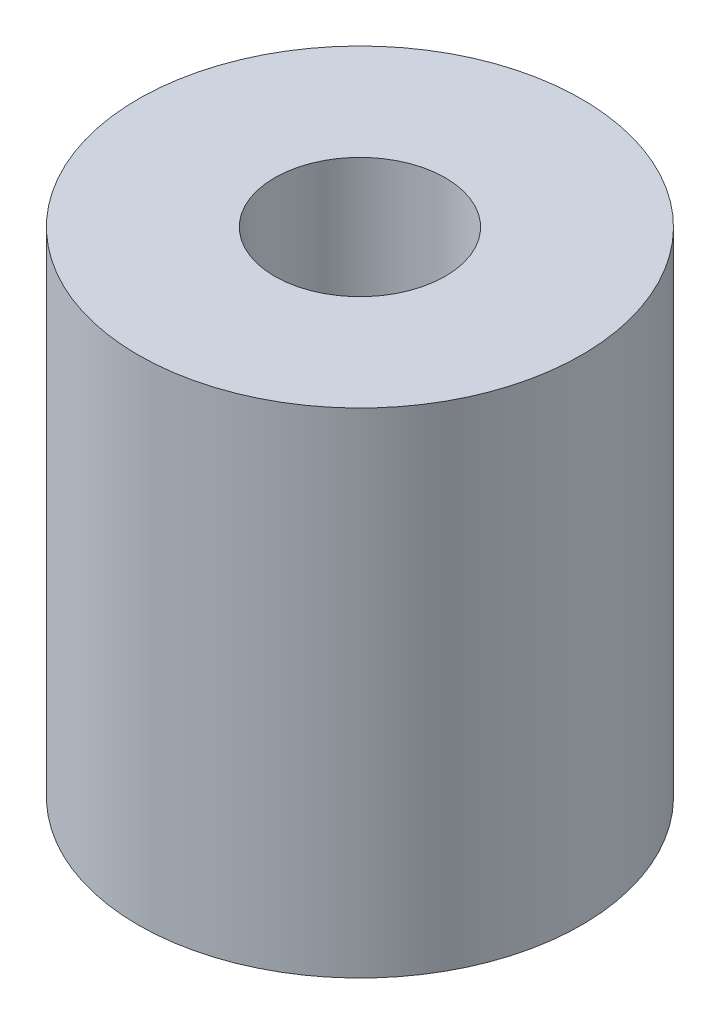
ISO-10303-21;
HEADER;
FILE_DESCRIPTION(('STEP AP214'),'2;1');
FILE_NAME('part.step','',(''),(''),'','','');
FILE_SCHEMA(('AUTOMOTIVE_DESIGN { 1 0 10303 214 1 1 1 1 }'));
ENDSEC;
DATA;
#1=APPLICATION_CONTEXT('core data for automotive mechanical design processes');
#2=APPLICATION_PROTOCOL_DEFINITION('international standard','automotive_design',2000,#1);
#3=PRODUCT_CONTEXT('',#1,'mechanical');
#4=PRODUCT('Part','Part','',(#3));
#5=PRODUCT_RELATED_PRODUCT_CATEGORY('part','',(#4));
#6=PRODUCT_DEFINITION_FORMATION('','',#4);
#7=PRODUCT_DEFINITION_CONTEXT('part definition',#1,'design');
#8=PRODUCT_DEFINITION('design','',#6,#7);
#9=PRODUCT_DEFINITION_SHAPE('','',#8);
#10=(LENGTH_UNIT() NAMED_UNIT(*) SI_UNIT(.MILLI.,.METRE.));
#11=(NAMED_UNIT(*) PLANE_ANGLE_UNIT() SI_UNIT($,.RADIAN.));
#12=(NAMED_UNIT(*) SI_UNIT($,.STERADIAN.) SOLID_ANGLE_UNIT());
#13=UNCERTAINTY_MEASURE_WITH_UNIT(LENGTH_MEASURE(1.E-05),#10,'distance_accuracy_value','');
#14=(GEOMETRIC_REPRESENTATION_CONTEXT(3) GLOBAL_UNCERTAINTY_ASSIGNED_CONTEXT((#13)) GLOBAL_UNIT_ASSIGNED_CONTEXT((#10,
#11,#12)) REPRESENTATION_CONTEXT('',''));
#15=CARTESIAN_POINT('',(0.,0.,0.));
#16=DIRECTION('',(0.,0.,1.));
#17=DIRECTION('',(1.,0.,0.));
#18=AXIS2_PLACEMENT_3D('',#15,#16,#17);
#19=CARTESIAN_POINT('',(0.,11.132,0.));
#20=DIRECTION('',(0.,-1.,0.));
#21=DIRECTION('',(0.,0.,-1.));
#22=AXIS2_PLACEMENT_3D('',#19,#20,#21);
#23=CYLINDRICAL_SURFACE('',#22,1.575);
#24=CARTESIAN_POINT('',(0.,0.,0.));
#25=DIRECTION('',(0.,1.,0.));
#26=DIRECTION('',(0.,0.,1.));
#27=AXIS2_PLACEMENT_3D('',#24,#25,#26);
#28=CIRCLE('',#27,1.575);
#29=CARTESIAN_POINT('',(0.,0.,1.575));
#30=VERTEX_POINT('',#29);
#31=EDGE_CURVE('E50',#30,#30,#28,.T.);
#32=ORIENTED_EDGE('',*,*,#31,.F.);
#33=EDGE_LOOP('',(#32));
#34=FACE_BOUND('',#33,.T.);
#35=CARTESIAN_POINT('',(0.,7.132,0.));
#36=DIRECTION('',(0.,1.,0.));
#37=DIRECTION('',(0.,0.,1.));
#38=AXIS2_PLACEMENT_3D('',#35,#36,#37);
#39=CIRCLE('',#38,1.575);
#40=CARTESIAN_POINT('',(0.,7.132,1.575));
#41=VERTEX_POINT('',#40);
#42=EDGE_CURVE('E58',#41,#41,#39,.F.);
#43=ORIENTED_EDGE('',*,*,#42,.F.);
#44=EDGE_LOOP('',(#43));
#45=FACE_BOUND('',#44,.T.);
#46=ADVANCED_FACE('F39',(#34,#45),#23,.F.);
#47=CARTESIAN_POINT('',(0.,11.132,0.));
#48=DIRECTION('',(0.,1.,0.));
#49=DIRECTION('',(0.,0.,1.));
#50=AXIS2_PLACEMENT_3D('',#47,#48,#49);
#51=PLANE('',#50);
#52=CARTESIAN_POINT('',(0.,11.132,0.));
#53=DIRECTION('',(0.,1.,0.));
#54=DIRECTION('',(0.,0.,1.));
#55=AXIS2_PLACEMENT_3D('',#52,#53,#54);
#56=CIRCLE('',#55,1.925);
#57=CARTESIAN_POINT('',(0.,11.132,1.925));
#58=VERTEX_POINT('',#57);
#59=EDGE_CURVE('E55',#58,#58,#56,.T.);
#60=ORIENTED_EDGE('',*,*,#59,.F.);
#61=EDGE_LOOP('',(#60));
#62=FACE_BOUND('',#61,.T.);
#63=CARTESIAN_POINT('',(0.,11.132,0.));
#64=DIRECTION('',(0.,1.,0.));
#65=DIRECTION('',(0.,0.,1.));
#66=AXIS2_PLACEMENT_3D('',#63,#64,#65);
#67=CIRCLE('',#66,5.);
#68=CARTESIAN_POINT('',(0.,11.132,5.));
#69=VERTEX_POINT('',#68);
#70=EDGE_CURVE('E10',#69,#69,#67,.T.);
#71=ORIENTED_EDGE('',*,*,#70,.T.);
#72=EDGE_LOOP('',(#71));
#73=FACE_BOUND('',#72,.T.);
#74=ADVANCED_FACE('F68',(#62,#73),#51,.T.);
#75=CARTESIAN_POINT('',(0.,0.,0.));
#76=DIRECTION('',(0.,1.,0.));
#77=DIRECTION('',(0.,0.,1.));
#78=AXIS2_PLACEMENT_3D('',#75,#76,#77);
#79=PLANE('',#78);
#80=CARTESIAN_POINT('',(0.,0.,0.));
#81=DIRECTION('',(0.,1.,0.));
#82=DIRECTION('',(0.,0.,1.));
#83=AXIS2_PLACEMENT_3D('',#80,#81,#82);
#84=CIRCLE('',#83,5.);
#85=CARTESIAN_POINT('',(0.,0.,5.));
#86=VERTEX_POINT('',#85);
#87=EDGE_CURVE('E43',#86,#86,#84,.T.);
#88=ORIENTED_EDGE('',*,*,#87,.F.);
#89=EDGE_LOOP('',(#88));
#90=FACE_BOUND('',#89,.T.);
#91=ORIENTED_EDGE('',*,*,#31,.T.);
#92=EDGE_LOOP('',(#91));
#93=FACE_BOUND('',#92,.T.);
#94=ADVANCED_FACE('F74',(#90,#93),#79,.F.);
#95=CARTESIAN_POINT('',(0.,11.132,0.));
#96=DIRECTION('',(0.,-1.,0.));
#97=DIRECTION('',(0.,0.,-1.));
#98=AXIS2_PLACEMENT_3D('',#95,#96,#97);
#99=CYLINDRICAL_SURFACE('',#98,5.);
#100=ORIENTED_EDGE('',*,*,#70,.F.);
#101=EDGE_LOOP('',(#100));
#102=FACE_BOUND('',#101,.T.);
#103=ORIENTED_EDGE('',*,*,#87,.T.);
#104=EDGE_LOOP('',(#103));
#105=FACE_BOUND('',#104,.T.);
#106=ADVANCED_FACE('F41',(#102,#105),#99,.T.);
#107=CARTESIAN_POINT('',(0.,7.132,0.));
#108=DIRECTION('',(0.,1.,0.));
#109=DIRECTION('',(0.,0.,1.));
#110=AXIS2_PLACEMENT_3D('',#107,#108,#109);
#111=CYLINDRICAL_SURFACE('',#110,1.925);
#112=CARTESIAN_POINT('',(0.,7.132,0.));
#113=DIRECTION('',(0.,1.,0.));
#114=DIRECTION('',(0.,0.,1.));
#115=AXIS2_PLACEMENT_3D('',#112,#113,#114);
#116=CIRCLE('',#115,1.925);
#117=CARTESIAN_POINT('',(0.,7.132,1.925));
#118=VERTEX_POINT('',#117);
#119=EDGE_CURVE('E54',#118,#118,#116,.T.);
#120=ORIENTED_EDGE('',*,*,#119,.F.);
#121=EDGE_LOOP('',(#120));
#122=FACE_BOUND('',#121,.T.);
#123=ORIENTED_EDGE('',*,*,#59,.T.);
#124=EDGE_LOOP('',(#123));
#125=FACE_BOUND('',#124,.T.);
#126=ADVANCED_FACE('F79',(#122,#125),#111,.F.);
#127=CARTESIAN_POINT('',(0.,7.132,0.));
#128=DIRECTION('',(0.,1.,0.));
#129=DIRECTION('',(0.,0.,1.));
#130=AXIS2_PLACEMENT_3D('',#127,#128,#129);
#131=PLANE('',#130);
#132=ORIENTED_EDGE('',*,*,#42,.T.);
#133=EDGE_LOOP('',(#132));
#134=FACE_BOUND('',#133,.T.);
#135=ORIENTED_EDGE('',*,*,#119,.T.);
#136=EDGE_LOOP('',(#135));
#137=FACE_BOUND('',#136,.T.);
#138=ADVANCED_FACE('F64',(#134,#137),#131,.T.);
#139=CLOSED_SHELL('',(#46,#74,#94,#106,#126,#138));
#140=MANIFOLD_SOLID_BREP('B2',#139);
#141=ADVANCED_BREP_SHAPE_REPRESENTATION('',(#18,#140),#14);
#142=SHAPE_DEFINITION_REPRESENTATION(#9,#141);
ENDSEC;
END-ISO-10303-21;
